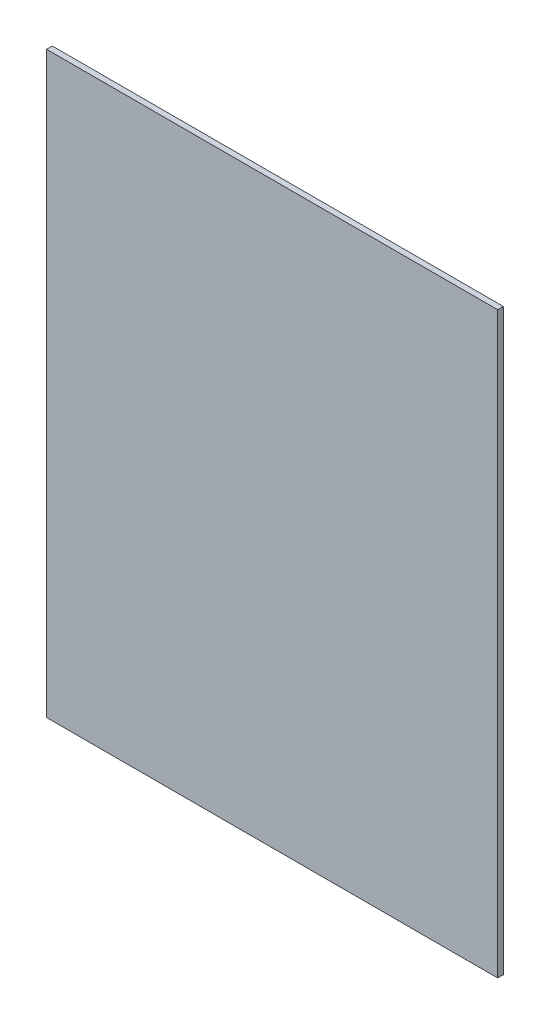
ISO-10303-21;
HEADER;
FILE_DESCRIPTION(('STEP AP214'),'2;1');
FILE_NAME('part.step','',(''),(''),'','','');
FILE_SCHEMA(('AUTOMOTIVE_DESIGN { 1 0 10303 214 1 1 1 1 }'));
ENDSEC;
DATA;
#1=APPLICATION_CONTEXT('core data for automotive mechanical design processes');
#2=APPLICATION_PROTOCOL_DEFINITION('international standard','automotive_design',2000,#1);
#3=PRODUCT_CONTEXT('',#1,'mechanical');
#4=PRODUCT('Part','Part','',(#3));
#5=PRODUCT_RELATED_PRODUCT_CATEGORY('part','',(#4));
#6=PRODUCT_DEFINITION_FORMATION('','',#4);
#7=PRODUCT_DEFINITION_CONTEXT('part definition',#1,'design');
#8=PRODUCT_DEFINITION('design','',#6,#7);
#9=PRODUCT_DEFINITION_SHAPE('','',#8);
#10=(LENGTH_UNIT() NAMED_UNIT(*) SI_UNIT(.MILLI.,.METRE.));
#11=(NAMED_UNIT(*) PLANE_ANGLE_UNIT() SI_UNIT($,.RADIAN.));
#12=(NAMED_UNIT(*) SI_UNIT($,.STERADIAN.) SOLID_ANGLE_UNIT());
#13=UNCERTAINTY_MEASURE_WITH_UNIT(LENGTH_MEASURE(1.E-05),#10,'distance_accuracy_value','');
#14=(GEOMETRIC_REPRESENTATION_CONTEXT(3) GLOBAL_UNCERTAINTY_ASSIGNED_CONTEXT((#13)) GLOBAL_UNIT_ASSIGNED_CONTEXT((#10,
#11,#12)) REPRESENTATION_CONTEXT('',''));
#15=CARTESIAN_POINT('',(0.,0.,0.));
#16=DIRECTION('',(0.,0.,1.));
#17=DIRECTION('',(1.,0.,0.));
#18=AXIS2_PLACEMENT_3D('',#15,#16,#17);
#19=CARTESIAN_POINT('',(-35.5,45.54002,0.));
#20=DIRECTION('',(-1.,0.,0.));
#21=DIRECTION('',(0.,0.,1.));
#22=AXIS2_PLACEMENT_3D('',#19,#20,#21);
#23=PLANE('',#22);
#24=DIRECTION('',(0.,-1.,0.));
#25=VECTOR('',#24,1.);
#26=CARTESIAN_POINT('',(-35.5,0.,0.89916));
#27=LINE('',#26,#25);
#28=CARTESIAN_POINT('',(-35.5,45.54002,0.89916));
#29=VERTEX_POINT('',#28);
#30=CARTESIAN_POINT('',(-35.5,-45.54002,0.89916));
#31=VERTEX_POINT('',#30);
#32=EDGE_CURVE('E68',#29,#31,#27,.T.);
#33=ORIENTED_EDGE('',*,*,#32,.F.);
#34=DIRECTION('',(0.,0.,-1.));
#35=VECTOR('',#34,1.);
#36=CARTESIAN_POINT('',(-35.5,45.54002,0.44958));
#37=LINE('',#36,#35);
#38=CARTESIAN_POINT('',(-35.5,45.54002,0.));
#39=VERTEX_POINT('',#38);
#40=EDGE_CURVE('E97',#29,#39,#37,.T.);
#41=ORIENTED_EDGE('',*,*,#40,.T.);
#42=DIRECTION('',(0.,-1.,0.));
#43=VECTOR('',#42,1.);
#44=CARTESIAN_POINT('',(-35.5,45.54002,0.));
#45=LINE('',#44,#43);
#46=CARTESIAN_POINT('',(-35.5,-45.54002,0.));
#47=VERTEX_POINT('',#46);
#48=EDGE_CURVE('E70',#39,#47,#45,.T.);
#49=ORIENTED_EDGE('',*,*,#48,.T.);
#50=DIRECTION('',(0.,0.,-1.));
#51=VECTOR('',#50,1.);
#52=CARTESIAN_POINT('',(-35.5,-45.54002,0.44958));
#53=LINE('',#52,#51);
#54=EDGE_CURVE('E10',#31,#47,#53,.T.);
#55=ORIENTED_EDGE('',*,*,#54,.F.);
#56=EDGE_LOOP('',(#33,#41,#49,#55));
#57=FACE_BOUND('',#56,.T.);
#58=ADVANCED_FACE('F15',(#57),#23,.T.);
#59=CARTESIAN_POINT('',(-35.5,-45.54002,0.));
#60=DIRECTION('',(0.,-1.,0.));
#61=DIRECTION('',(0.,0.,-1.));
#62=AXIS2_PLACEMENT_3D('',#59,#60,#61);
#63=PLANE('',#62);
#64=DIRECTION('',(1.,0.,0.));
#65=VECTOR('',#64,1.);
#66=CARTESIAN_POINT('',(0.,-45.54002,0.89916));
#67=LINE('',#66,#65);
#68=CARTESIAN_POINT('',(35.5,-45.54002,0.89916));
#69=VERTEX_POINT('',#68);
#70=EDGE_CURVE('E74',#31,#69,#67,.T.);
#71=ORIENTED_EDGE('',*,*,#70,.F.);
#72=ORIENTED_EDGE('',*,*,#54,.T.);
#73=DIRECTION('',(1.,0.,0.));
#74=VECTOR('',#73,1.);
#75=CARTESIAN_POINT('',(-35.5,-45.54002,0.));
#76=LINE('',#75,#74);
#77=CARTESIAN_POINT('',(35.5,-45.54002,0.));
#78=VERTEX_POINT('',#77);
#79=EDGE_CURVE('E19',#47,#78,#76,.T.);
#80=ORIENTED_EDGE('',*,*,#79,.T.);
#81=DIRECTION('',(0.,0.,-1.));
#82=VECTOR('',#81,1.);
#83=CARTESIAN_POINT('',(35.5,-45.54002,0.44958));
#84=LINE('',#83,#82);
#85=EDGE_CURVE('E26',#69,#78,#84,.T.);
#86=ORIENTED_EDGE('',*,*,#85,.F.);
#87=EDGE_LOOP('',(#71,#72,#80,#86));
#88=FACE_BOUND('',#87,.T.);
#89=ADVANCED_FACE('F75',(#88),#63,.T.);
#90=CARTESIAN_POINT('',(35.5,-45.54002,0.));
#91=DIRECTION('',(1.,0.,0.));
#92=DIRECTION('',(0.,1.,0.));
#93=AXIS2_PLACEMENT_3D('',#90,#91,#92);
#94=PLANE('',#93);
#95=DIRECTION('',(0.,1.,0.));
#96=VECTOR('',#95,1.);
#97=CARTESIAN_POINT('',(35.5,0.,0.89916));
#98=LINE('',#97,#96);
#99=CARTESIAN_POINT('',(35.5,45.54002,0.89916));
#100=VERTEX_POINT('',#99);
#101=EDGE_CURVE('E79',#69,#100,#98,.T.);
#102=ORIENTED_EDGE('',*,*,#101,.F.);
#103=ORIENTED_EDGE('',*,*,#85,.T.);
#104=DIRECTION('',(0.,1.,0.));
#105=VECTOR('',#104,1.);
#106=CARTESIAN_POINT('',(35.5,-45.54002,0.));
#107=LINE('',#106,#105);
#108=CARTESIAN_POINT('',(35.5,45.54002,0.));
#109=VERTEX_POINT('',#108);
#110=EDGE_CURVE('E92',#78,#109,#107,.T.);
#111=ORIENTED_EDGE('',*,*,#110,.T.);
#112=DIRECTION('',(0.,0.,-1.));
#113=VECTOR('',#112,1.);
#114=CARTESIAN_POINT('',(35.5,45.54002,0.44958));
#115=LINE('',#114,#113);
#116=EDGE_CURVE('E100',#100,#109,#115,.T.);
#117=ORIENTED_EDGE('',*,*,#116,.F.);
#118=EDGE_LOOP('',(#102,#103,#111,#117));
#119=FACE_BOUND('',#118,.T.);
#120=ADVANCED_FACE('F110',(#119),#94,.T.);
#121=CARTESIAN_POINT('',(35.5,45.54002,0.));
#122=DIRECTION('',(0.,1.,0.));
#123=DIRECTION('',(1.,0.,0.));
#124=AXIS2_PLACEMENT_3D('',#121,#122,#123);
#125=PLANE('',#124);
#126=DIRECTION('',(-1.,0.,0.));
#127=VECTOR('',#126,1.);
#128=CARTESIAN_POINT('',(0.,45.54002,0.89916));
#129=LINE('',#128,#127);
#130=EDGE_CURVE('E84',#100,#29,#129,.T.);
#131=ORIENTED_EDGE('',*,*,#130,.F.);
#132=ORIENTED_EDGE('',*,*,#116,.T.);
#133=DIRECTION('',(-1.,0.,0.));
#134=VECTOR('',#133,1.);
#135=CARTESIAN_POINT('',(35.5,45.54002,0.));
#136=LINE('',#135,#134);
#137=EDGE_CURVE('E93',#109,#39,#136,.T.);
#138=ORIENTED_EDGE('',*,*,#137,.T.);
#139=ORIENTED_EDGE('',*,*,#40,.F.);
#140=EDGE_LOOP('',(#131,#132,#138,#139));
#141=FACE_BOUND('',#140,.T.);
#142=ADVANCED_FACE('F17',(#141),#125,.T.);
#143=CARTESIAN_POINT('',(0.,0.,0.));
#144=DIRECTION('',(0.,0.,1.));
#145=DIRECTION('',(1.,0.,0.));
#146=AXIS2_PLACEMENT_3D('',#143,#144,#145);
#147=PLANE('',#146);
#148=ORIENTED_EDGE('',*,*,#48,.F.);
#149=ORIENTED_EDGE('',*,*,#137,.F.);
#150=ORIENTED_EDGE('',*,*,#110,.F.);
#151=ORIENTED_EDGE('',*,*,#79,.F.);
#152=EDGE_LOOP('',(#148,#149,#150,#151));
#153=FACE_BOUND('',#152,.T.);
#154=ADVANCED_FACE('F149',(#153),#147,.F.);
#155=CARTESIAN_POINT('',(0.,0.,0.89916));
#156=DIRECTION('',(0.,0.,1.));
#157=DIRECTION('',(1.,0.,0.));
#158=AXIS2_PLACEMENT_3D('',#155,#156,#157);
#159=PLANE('',#158);
#160=ORIENTED_EDGE('',*,*,#32,.T.);
#161=ORIENTED_EDGE('',*,*,#70,.T.);
#162=ORIENTED_EDGE('',*,*,#101,.T.);
#163=ORIENTED_EDGE('',*,*,#130,.T.);
#164=EDGE_LOOP('',(#160,#161,#162,#163));
#165=FACE_BOUND('',#164,.T.);
#166=ADVANCED_FACE('F82',(#165),#159,.T.);
#167=CLOSED_SHELL('',(#58,#89,#120,#142,#154,#166));
#168=MANIFOLD_SOLID_BREP('B1',#167);
#169=ADVANCED_BREP_SHAPE_REPRESENTATION('',(#18,#168),#14);
#170=SHAPE_DEFINITION_REPRESENTATION(#9,#169);
ENDSEC;
END-ISO-10303-21;
